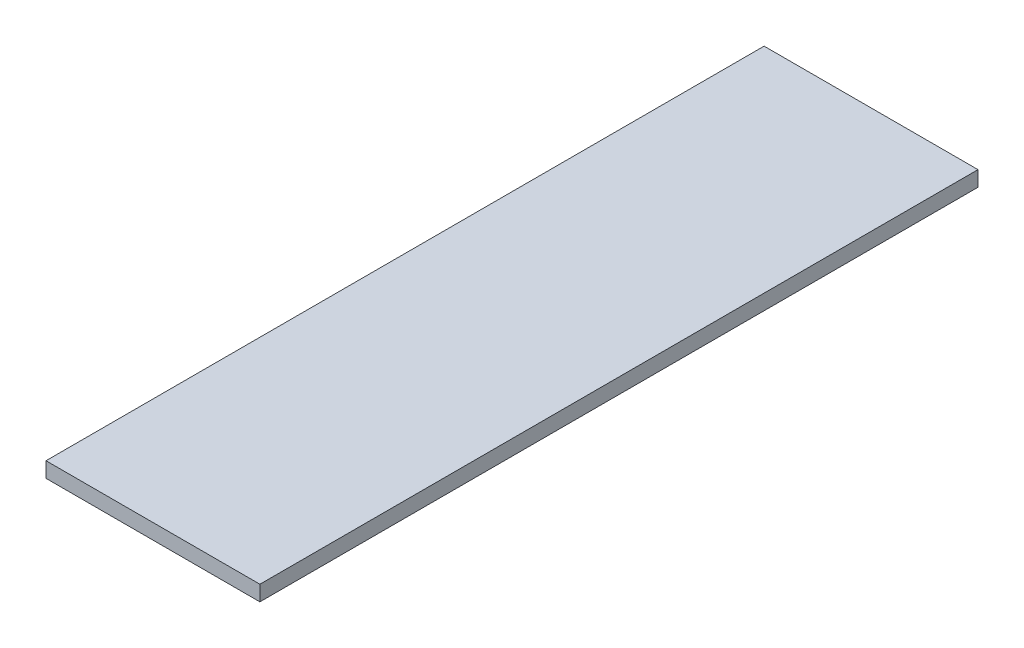
ISO-10303-21;
HEADER;
FILE_DESCRIPTION(('STEP AP214'),'2;1');
FILE_NAME('part.step','',(''),(''),'','','');
FILE_SCHEMA(('AUTOMOTIVE_DESIGN { 1 0 10303 214 1 1 1 1 }'));
ENDSEC;
DATA;
#1=APPLICATION_CONTEXT('core data for automotive mechanical design processes');
#2=APPLICATION_PROTOCOL_DEFINITION('international standard','automotive_design',2000,#1);
#3=PRODUCT_CONTEXT('',#1,'mechanical');
#4=PRODUCT('Part','Part','',(#3));
#5=PRODUCT_RELATED_PRODUCT_CATEGORY('part','',(#4));
#6=PRODUCT_DEFINITION_FORMATION('','',#4);
#7=PRODUCT_DEFINITION_CONTEXT('part definition',#1,'design');
#8=PRODUCT_DEFINITION('design','',#6,#7);
#9=PRODUCT_DEFINITION_SHAPE('','',#8);
#10=(LENGTH_UNIT() NAMED_UNIT(*) SI_UNIT(.MILLI.,.METRE.));
#11=(NAMED_UNIT(*) PLANE_ANGLE_UNIT() SI_UNIT($,.RADIAN.));
#12=(NAMED_UNIT(*) SI_UNIT($,.STERADIAN.) SOLID_ANGLE_UNIT());
#13=UNCERTAINTY_MEASURE_WITH_UNIT(LENGTH_MEASURE(1.E-05),#10,'distance_accuracy_value','');
#14=(GEOMETRIC_REPRESENTATION_CONTEXT(3) GLOBAL_UNCERTAINTY_ASSIGNED_CONTEXT((#13)) GLOBAL_UNIT_ASSIGNED_CONTEXT((#10,
#11,#12)) REPRESENTATION_CONTEXT('',''));
#15=CARTESIAN_POINT('',(0.,0.,0.));
#16=DIRECTION('',(0.,0.,1.));
#17=DIRECTION('',(1.,0.,0.));
#18=AXIS2_PLACEMENT_3D('',#15,#16,#17);
#19=CARTESIAN_POINT('',(-1049.99999999998,-150.,-150.000000000034));
#20=DIRECTION('',(-1.,0.,0.));
#21=DIRECTION('',(0.,0.,1.));
#22=AXIS2_PLACEMENT_3D('',#19,#20,#21);
#23=PLANE('',#22);
#24=DIRECTION('',(0.,0.,1.));
#25=VECTOR('',#24,1.);
#26=CARTESIAN_POINT('',(-1049.99999999998,0.,-150.000000000034));
#27=LINE('',#26,#25);
#28=CARTESIAN_POINT('',(-1049.99999999998,0.,-150.000000000034));
#29=VERTEX_POINT('',#28);
#30=CARTESIAN_POINT('',(-1049.99999999998,0.,6899.99999999999));
#31=VERTEX_POINT('',#30);
#32=EDGE_CURVE('E107',#29,#31,#27,.T.);
#33=ORIENTED_EDGE('',*,*,#32,.F.);
#34=DIRECTION('',(0.,1.,0.));
#35=VECTOR('',#34,1.);
#36=CARTESIAN_POINT('',(-1049.99999999998,-150.,-150.000000000034));
#37=LINE('',#36,#35);
#38=CARTESIAN_POINT('',(-1049.99999999998,-150.,-150.000000000034));
#39=VERTEX_POINT('',#38);
#40=EDGE_CURVE('E11',#39,#29,#37,.T.);
#41=ORIENTED_EDGE('',*,*,#40,.F.);
#42=DIRECTION('',(0.,0.,1.));
#43=VECTOR('',#42,1.);
#44=CARTESIAN_POINT('',(-1049.99999999998,-150.,-150.000000000034));
#45=LINE('',#44,#43);
#46=CARTESIAN_POINT('',(-1049.99999999998,-150.,6899.99999999999));
#47=VERTEX_POINT('',#46);
#48=EDGE_CURVE('E98',#39,#47,#45,.T.);
#49=ORIENTED_EDGE('',*,*,#48,.T.);
#50=DIRECTION('',(0.,1.,0.));
#51=VECTOR('',#50,1.);
#52=CARTESIAN_POINT('',(-1049.99999999998,-150.,6899.99999999999));
#53=LINE('',#52,#51);
#54=EDGE_CURVE('E39',#47,#31,#53,.T.);
#55=ORIENTED_EDGE('',*,*,#54,.T.);
#56=EDGE_LOOP('',(#33,#41,#49,#55));
#57=FACE_BOUND('',#56,.T.);
#58=ADVANCED_FACE('F36',(#57),#23,.T.);
#59=CARTESIAN_POINT('',(-1049.99999999998,-150.,-150.000000000034));
#60=DIRECTION('',(0.,0.,-1.));
#61=DIRECTION('',(-1.,0.,0.));
#62=AXIS2_PLACEMENT_3D('',#59,#60,#61);
#63=PLANE('',#62);
#64=DIRECTION('',(-1.,0.,0.));
#65=VECTOR('',#64,1.);
#66=CARTESIAN_POINT('',(-1049.99999999998,0.,-150.000000000034));
#67=LINE('',#66,#65);
#68=CARTESIAN_POINT('',(1049.99999999998,0.,-150.000000000034));
#69=VERTEX_POINT('',#68);
#70=EDGE_CURVE('E102',#69,#29,#67,.T.);
#71=ORIENTED_EDGE('',*,*,#70,.F.);
#72=DIRECTION('',(0.,1.,0.));
#73=VECTOR('',#72,1.);
#74=CARTESIAN_POINT('',(1049.99999999998,-150.,-150.000000000034));
#75=LINE('',#74,#73);
#76=CARTESIAN_POINT('',(1049.99999999998,-150.,-150.000000000034));
#77=VERTEX_POINT('',#76);
#78=EDGE_CURVE('E46',#77,#69,#75,.T.);
#79=ORIENTED_EDGE('',*,*,#78,.F.);
#80=DIRECTION('',(-1.,0.,0.));
#81=VECTOR('',#80,1.);
#82=CARTESIAN_POINT('',(-1049.99999999998,-150.,-150.000000000034));
#83=LINE('',#82,#81);
#84=EDGE_CURVE('E93',#77,#39,#83,.T.);
#85=ORIENTED_EDGE('',*,*,#84,.T.);
#86=ORIENTED_EDGE('',*,*,#40,.T.);
#87=EDGE_LOOP('',(#71,#79,#85,#86));
#88=FACE_BOUND('',#87,.T.);
#89=ADVANCED_FACE('F129',(#88),#63,.T.);
#90=CARTESIAN_POINT('',(1049.99999999998,-150.,-150.000000000034));
#91=DIRECTION('',(1.,0.,0.));
#92=DIRECTION('',(0.,0.,-1.));
#93=AXIS2_PLACEMENT_3D('',#90,#91,#92);
#94=PLANE('',#93);
#95=DIRECTION('',(0.,0.,-1.));
#96=VECTOR('',#95,1.);
#97=CARTESIAN_POINT('',(1049.99999999998,0.,-150.000000000034));
#98=LINE('',#97,#96);
#99=CARTESIAN_POINT('',(1049.99999999998,0.,6899.99999999999));
#100=VERTEX_POINT('',#99);
#101=EDGE_CURVE('E87',#100,#69,#98,.T.);
#102=ORIENTED_EDGE('',*,*,#101,.F.);
#103=DIRECTION('',(0.,1.,0.));
#104=VECTOR('',#103,1.);
#105=CARTESIAN_POINT('',(1049.99999999998,-150.,6899.99999999999));
#106=LINE('',#105,#104);
#107=CARTESIAN_POINT('',(1049.99999999998,-150.,6899.99999999999));
#108=VERTEX_POINT('',#107);
#109=EDGE_CURVE('E82',#108,#100,#106,.T.);
#110=ORIENTED_EDGE('',*,*,#109,.F.);
#111=DIRECTION('',(0.,0.,-1.));
#112=VECTOR('',#111,1.);
#113=CARTESIAN_POINT('',(1049.99999999998,-150.,-150.000000000034));
#114=LINE('',#113,#112);
#115=EDGE_CURVE('E85',#108,#77,#114,.T.);
#116=ORIENTED_EDGE('',*,*,#115,.T.);
#117=ORIENTED_EDGE('',*,*,#78,.T.);
#118=EDGE_LOOP('',(#102,#110,#116,#117));
#119=FACE_BOUND('',#118,.T.);
#120=ADVANCED_FACE('F84',(#119),#94,.T.);
#121=CARTESIAN_POINT('',(-1049.99999999998,-150.,6899.99999999999));
#122=DIRECTION('',(0.,0.,1.));
#123=DIRECTION('',(1.,0.,0.));
#124=AXIS2_PLACEMENT_3D('',#121,#122,#123);
#125=PLANE('',#124);
#126=DIRECTION('',(1.,0.,0.));
#127=VECTOR('',#126,1.);
#128=CARTESIAN_POINT('',(-1049.99999999998,0.,6899.99999999999));
#129=LINE('',#128,#127);
#130=EDGE_CURVE('E111',#31,#100,#129,.T.);
#131=ORIENTED_EDGE('',*,*,#130,.F.);
#132=ORIENTED_EDGE('',*,*,#54,.F.);
#133=DIRECTION('',(1.,0.,0.));
#134=VECTOR('',#133,1.);
#135=CARTESIAN_POINT('',(-1049.99999999998,-150.,6899.99999999999));
#136=LINE('',#135,#134);
#137=EDGE_CURVE('E92',#47,#108,#136,.T.);
#138=ORIENTED_EDGE('',*,*,#137,.T.);
#139=ORIENTED_EDGE('',*,*,#109,.T.);
#140=EDGE_LOOP('',(#131,#132,#138,#139));
#141=FACE_BOUND('',#140,.T.);
#142=ADVANCED_FACE('F96',(#141),#125,.T.);
#143=CARTESIAN_POINT('',(0.,-150.,0.));
#144=DIRECTION('',(0.,1.,0.));
#145=DIRECTION('',(0.,0.,1.));
#146=AXIS2_PLACEMENT_3D('',#143,#144,#145);
#147=PLANE('',#146);
#148=ORIENTED_EDGE('',*,*,#48,.F.);
#149=ORIENTED_EDGE('',*,*,#84,.F.);
#150=ORIENTED_EDGE('',*,*,#115,.F.);
#151=ORIENTED_EDGE('',*,*,#137,.F.);
#152=EDGE_LOOP('',(#148,#149,#150,#151));
#153=FACE_BOUND('',#152,.T.);
#154=ADVANCED_FACE('F91',(#153),#147,.F.);
#155=CARTESIAN_POINT('',(0.,0.,0.));
#156=DIRECTION('',(0.,1.,0.));
#157=DIRECTION('',(0.,0.,1.));
#158=AXIS2_PLACEMENT_3D('',#155,#156,#157);
#159=PLANE('',#158);
#160=ORIENTED_EDGE('',*,*,#32,.T.);
#161=ORIENTED_EDGE('',*,*,#130,.T.);
#162=ORIENTED_EDGE('',*,*,#101,.T.);
#163=ORIENTED_EDGE('',*,*,#70,.T.);
#164=EDGE_LOOP('',(#160,#161,#162,#163));
#165=FACE_BOUND('',#164,.T.);
#166=ADVANCED_FACE('F128',(#165),#159,.T.);
#167=CLOSED_SHELL('',(#58,#89,#120,#142,#154,#166));
#168=MANIFOLD_SOLID_BREP('B2',#167);
#169=ADVANCED_BREP_SHAPE_REPRESENTATION('',(#18,#168),#14);
#170=SHAPE_DEFINITION_REPRESENTATION(#9,#169);
ENDSEC;
END-ISO-10303-21;
